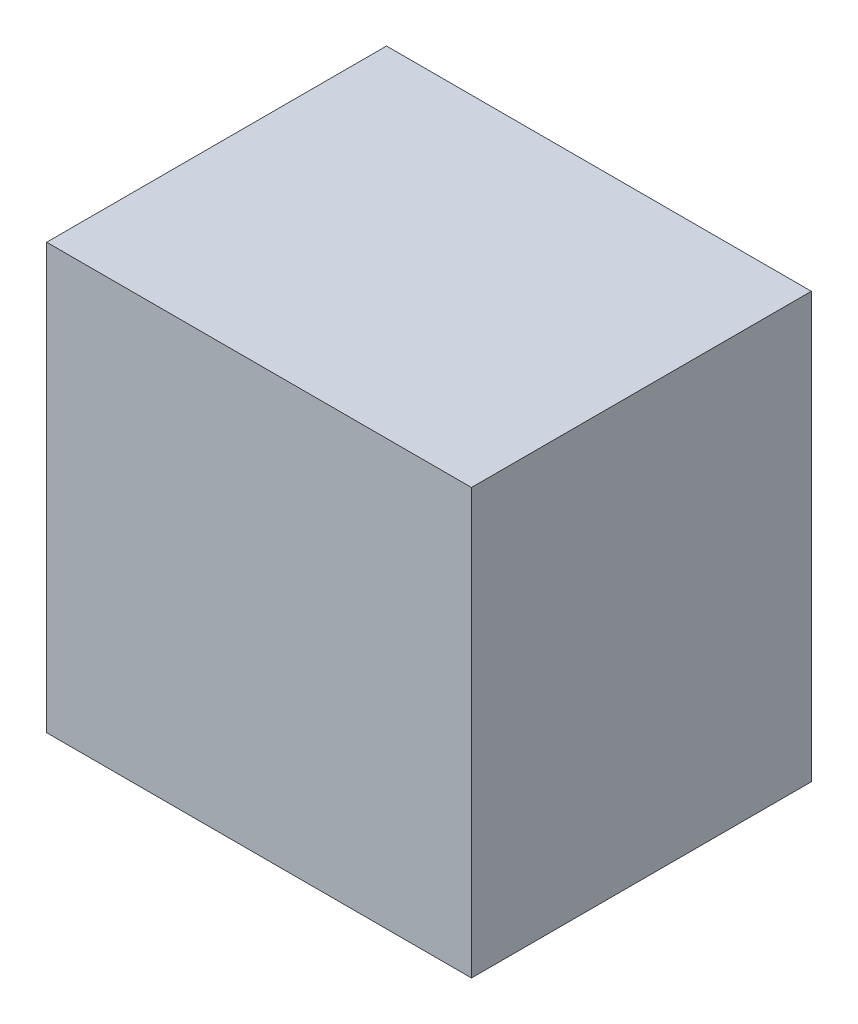
ISO-10303-21;
HEADER;
FILE_DESCRIPTION(('STEP AP214'),'2;1');
FILE_NAME('part.step','',(''),(''),'','','');
FILE_SCHEMA(('AUTOMOTIVE_DESIGN { 1 0 10303 214 1 1 1 1 }'));
ENDSEC;
DATA;
#1=APPLICATION_CONTEXT('core data for automotive mechanical design processes');
#2=APPLICATION_PROTOCOL_DEFINITION('international standard','automotive_design',2000,#1);
#3=PRODUCT_CONTEXT('',#1,'mechanical');
#4=PRODUCT('Part','Part','',(#3));
#5=PRODUCT_RELATED_PRODUCT_CATEGORY('part','',(#4));
#6=PRODUCT_DEFINITION_FORMATION('','',#4);
#7=PRODUCT_DEFINITION_CONTEXT('part definition',#1,'design');
#8=PRODUCT_DEFINITION('design','',#6,#7);
#9=PRODUCT_DEFINITION_SHAPE('','',#8);
#10=(LENGTH_UNIT() NAMED_UNIT(*) SI_UNIT(.MILLI.,.METRE.));
#11=(NAMED_UNIT(*) PLANE_ANGLE_UNIT() SI_UNIT($,.RADIAN.));
#12=(NAMED_UNIT(*) SI_UNIT($,.STERADIAN.) SOLID_ANGLE_UNIT());
#13=UNCERTAINTY_MEASURE_WITH_UNIT(LENGTH_MEASURE(1.E-05),#10,'distance_accuracy_value','');
#14=(GEOMETRIC_REPRESENTATION_CONTEXT(3) GLOBAL_UNCERTAINTY_ASSIGNED_CONTEXT((#13)) GLOBAL_UNIT_ASSIGNED_CONTEXT((#10,
#11,#12)) REPRESENTATION_CONTEXT('',''));
#15=CARTESIAN_POINT('',(0.,0.,0.));
#16=DIRECTION('',(0.,0.,1.));
#17=DIRECTION('',(1.,0.,0.));
#18=AXIS2_PLACEMENT_3D('',#15,#16,#17);
#19=CARTESIAN_POINT('',(0.,0.,1.));
#20=DIRECTION('',(0.,0.,1.));
#21=DIRECTION('',(1.,0.,0.));
#22=AXIS2_PLACEMENT_3D('',#19,#20,#21);
#23=PLANE('',#22);
#24=DIRECTION('',(1.,0.,0.));
#25=VECTOR('',#24,1.);
#26=CARTESIAN_POINT('',(0.25,1.,1.));
#27=LINE('',#26,#25);
#28=CARTESIAN_POINT('',(-1.,1.,1.));
#29=VERTEX_POINT('',#28);
#30=CARTESIAN_POINT('',(0.25,1.,1.));
#31=VERTEX_POINT('',#30);
#32=EDGE_CURVE('E68',#29,#31,#27,.T.);
#33=ORIENTED_EDGE('',*,*,#32,.F.);
#34=DIRECTION('',(0.,1.,0.));
#35=VECTOR('',#34,1.);
#36=CARTESIAN_POINT('',(-1.,1.,1.));
#37=LINE('',#36,#35);
#38=CARTESIAN_POINT('',(-1.,-0.25,1.));
#39=VERTEX_POINT('',#38);
#40=EDGE_CURVE('E20',#39,#29,#37,.T.);
#41=ORIENTED_EDGE('',*,*,#40,.F.);
#42=DIRECTION('',(1.,0.,0.));
#43=VECTOR('',#42,1.);
#44=CARTESIAN_POINT('',(-1.,-0.25,1.));
#45=LINE('',#44,#43);
#46=CARTESIAN_POINT('',(0.25,-0.25,1.));
#47=VERTEX_POINT('',#46);
#48=EDGE_CURVE('E58',#47,#39,#45,.F.);
#49=ORIENTED_EDGE('',*,*,#48,.F.);
#50=DIRECTION('',(0.,1.,0.));
#51=VECTOR('',#50,1.);
#52=CARTESIAN_POINT('',(0.25,-0.25,1.));
#53=LINE('',#52,#51);
#54=EDGE_CURVE('E53',#31,#47,#53,.F.);
#55=ORIENTED_EDGE('',*,*,#54,.F.);
#56=EDGE_LOOP('',(#33,#41,#49,#55));
#57=FACE_BOUND('',#56,.T.);
#58=ADVANCED_FACE('F17',(#57),#23,.T.);
#59=CARTESIAN_POINT('',(-1.,1.,0.));
#60=DIRECTION('',(-1.,0.,0.));
#61=DIRECTION('',(0.,0.,1.));
#62=AXIS2_PLACEMENT_3D('',#59,#60,#61);
#63=PLANE('',#62);
#64=DIRECTION('',(0.,0.,1.));
#65=VECTOR('',#64,1.);
#66=CARTESIAN_POINT('',(-1.,1.,0.));
#67=LINE('',#66,#65);
#68=CARTESIAN_POINT('',(-1.,1.,0.));
#69=VERTEX_POINT('',#68);
#70=EDGE_CURVE('E79',#69,#29,#67,.T.);
#71=ORIENTED_EDGE('',*,*,#70,.F.);
#72=DIRECTION('',(0.,1.,0.));
#73=VECTOR('',#72,1.);
#74=CARTESIAN_POINT('',(-1.,0.,0.));
#75=LINE('',#74,#73);
#76=CARTESIAN_POINT('',(-1.,-0.25,0.));
#77=VERTEX_POINT('',#76);
#78=EDGE_CURVE('E74',#69,#77,#75,.F.);
#79=ORIENTED_EDGE('',*,*,#78,.T.);
#80=DIRECTION('',(0.,0.,-1.));
#81=VECTOR('',#80,1.);
#82=CARTESIAN_POINT('',(-1.,-0.25,0.));
#83=LINE('',#82,#81);
#84=EDGE_CURVE('E63',#39,#77,#83,.T.);
#85=ORIENTED_EDGE('',*,*,#84,.F.);
#86=ORIENTED_EDGE('',*,*,#40,.T.);
#87=EDGE_LOOP('',(#71,#79,#85,#86));
#88=FACE_BOUND('',#87,.T.);
#89=ADVANCED_FACE('F73',(#88),#63,.T.);
#90=CARTESIAN_POINT('',(-1.,-0.25,0.));
#91=DIRECTION('',(0.,-1.,0.));
#92=DIRECTION('',(0.,0.,-1.));
#93=AXIS2_PLACEMENT_3D('',#90,#91,#92);
#94=PLANE('',#93);
#95=ORIENTED_EDGE('',*,*,#84,.T.);
#96=DIRECTION('',(1.,0.,0.));
#97=VECTOR('',#96,1.);
#98=CARTESIAN_POINT('',(0.,-0.25,0.));
#99=LINE('',#98,#97);
#100=CARTESIAN_POINT('',(0.25,-0.25,0.));
#101=VERTEX_POINT('',#100);
#102=EDGE_CURVE('E84',#77,#101,#99,.T.);
#103=ORIENTED_EDGE('',*,*,#102,.T.);
#104=DIRECTION('',(0.,0.,-1.));
#105=VECTOR('',#104,1.);
#106=CARTESIAN_POINT('',(0.25,-0.25,0.));
#107=LINE('',#106,#105);
#108=EDGE_CURVE('E65',#47,#101,#107,.T.);
#109=ORIENTED_EDGE('',*,*,#108,.F.);
#110=ORIENTED_EDGE('',*,*,#48,.T.);
#111=EDGE_LOOP('',(#95,#103,#109,#110));
#112=FACE_BOUND('',#111,.T.);
#113=ADVANCED_FACE('F60',(#112),#94,.T.);
#114=CARTESIAN_POINT('',(0.25,-0.25,0.));
#115=DIRECTION('',(1.,0.,0.));
#116=DIRECTION('',(0.,0.,-1.));
#117=AXIS2_PLACEMENT_3D('',#114,#115,#116);
#118=PLANE('',#117);
#119=ORIENTED_EDGE('',*,*,#108,.T.);
#120=DIRECTION('',(0.,1.,0.));
#121=VECTOR('',#120,1.);
#122=CARTESIAN_POINT('',(0.25,0.,0.));
#123=LINE('',#122,#121);
#124=CARTESIAN_POINT('',(0.25,1.,0.));
#125=VERTEX_POINT('',#124);
#126=EDGE_CURVE('E26',#101,#125,#123,.T.);
#127=ORIENTED_EDGE('',*,*,#126,.T.);
#128=DIRECTION('',(0.,0.,1.));
#129=VECTOR('',#128,1.);
#130=CARTESIAN_POINT('',(0.25,1.,0.));
#131=LINE('',#130,#129);
#132=EDGE_CURVE('E34',#31,#125,#131,.F.);
#133=ORIENTED_EDGE('',*,*,#132,.F.);
#134=ORIENTED_EDGE('',*,*,#54,.T.);
#135=EDGE_LOOP('',(#119,#127,#133,#134));
#136=FACE_BOUND('',#135,.T.);
#137=ADVANCED_FACE('F88',(#136),#118,.T.);
#138=CARTESIAN_POINT('',(0.25,1.,0.));
#139=DIRECTION('',(0.,1.,0.));
#140=DIRECTION('',(0.,0.,1.));
#141=AXIS2_PLACEMENT_3D('',#138,#139,#140);
#142=PLANE('',#141);
#143=ORIENTED_EDGE('',*,*,#132,.T.);
#144=DIRECTION('',(1.,0.,0.));
#145=VECTOR('',#144,1.);
#146=CARTESIAN_POINT('',(0.,1.,0.));
#147=LINE('',#146,#145);
#148=EDGE_CURVE('E11',#125,#69,#147,.F.);
#149=ORIENTED_EDGE('',*,*,#148,.T.);
#150=ORIENTED_EDGE('',*,*,#70,.T.);
#151=ORIENTED_EDGE('',*,*,#32,.T.);
#152=EDGE_LOOP('',(#143,#149,#150,#151));
#153=FACE_BOUND('',#152,.T.);
#154=ADVANCED_FACE('F91',(#153),#142,.T.);
#155=CARTESIAN_POINT('',(0.,0.,0.));
#156=DIRECTION('',(0.,0.,1.));
#157=DIRECTION('',(1.,0.,0.));
#158=AXIS2_PLACEMENT_3D('',#155,#156,#157);
#159=PLANE('',#158);
#160=ORIENTED_EDGE('',*,*,#126,.F.);
#161=ORIENTED_EDGE('',*,*,#102,.F.);
#162=ORIENTED_EDGE('',*,*,#78,.F.);
#163=ORIENTED_EDGE('',*,*,#148,.F.);
#164=EDGE_LOOP('',(#160,#161,#162,#163));
#165=FACE_BOUND('',#164,.T.);
#166=ADVANCED_FACE('F90',(#165),#159,.F.);
#167=CLOSED_SHELL('',(#58,#89,#113,#137,#154,#166));
#168=MANIFOLD_SOLID_BREP('B1',#167);
#169=ADVANCED_BREP_SHAPE_REPRESENTATION('',(#18,#168),#14);
#170=SHAPE_DEFINITION_REPRESENTATION(#9,#169);
ENDSEC;
END-ISO-10303-21;
